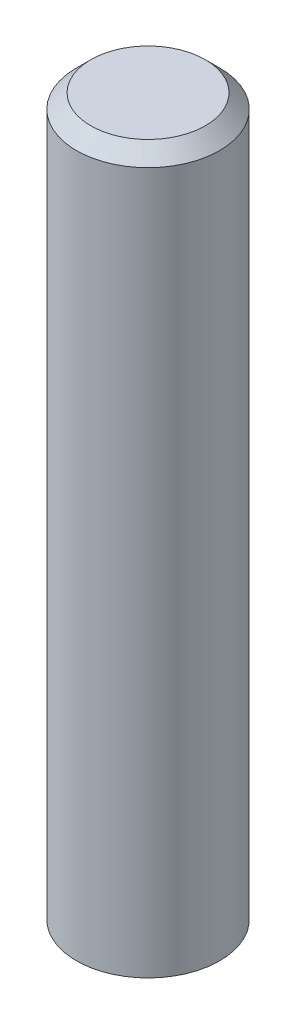
ISO-10303-21;
HEADER;
FILE_DESCRIPTION(('STEP AP214'),'2;1');
FILE_NAME('part.step','',(''),(''),'','','');
FILE_SCHEMA(('AUTOMOTIVE_DESIGN { 1 0 10303 214 1 1 1 1 }'));
ENDSEC;
DATA;
#1=APPLICATION_CONTEXT('core data for automotive mechanical design processes');
#2=APPLICATION_PROTOCOL_DEFINITION('international standard','automotive_design',2000,#1);
#3=PRODUCT_CONTEXT('',#1,'mechanical');
#4=PRODUCT('Part','Part','',(#3));
#5=PRODUCT_RELATED_PRODUCT_CATEGORY('part','',(#4));
#6=PRODUCT_DEFINITION_FORMATION('','',#4);
#7=PRODUCT_DEFINITION_CONTEXT('part definition',#1,'design');
#8=PRODUCT_DEFINITION('design','',#6,#7);
#9=PRODUCT_DEFINITION_SHAPE('','',#8);
#10=(LENGTH_UNIT() NAMED_UNIT(*) SI_UNIT(.MILLI.,.METRE.));
#11=(NAMED_UNIT(*) PLANE_ANGLE_UNIT() SI_UNIT($,.RADIAN.));
#12=(NAMED_UNIT(*) SI_UNIT($,.STERADIAN.) SOLID_ANGLE_UNIT());
#13=UNCERTAINTY_MEASURE_WITH_UNIT(LENGTH_MEASURE(1.E-05),#10,'distance_accuracy_value','');
#14=(GEOMETRIC_REPRESENTATION_CONTEXT(3) GLOBAL_UNCERTAINTY_ASSIGNED_CONTEXT((#13)) GLOBAL_UNIT_ASSIGNED_CONTEXT((#10,
#11,#12)) REPRESENTATION_CONTEXT('',''));
#15=CARTESIAN_POINT('',(0.,0.,0.));
#16=DIRECTION('',(0.,0.,1.));
#17=DIRECTION('',(1.,0.,0.));
#18=AXIS2_PLACEMENT_3D('',#15,#16,#17);
#19=CARTESIAN_POINT('',(0.,24.5,0.));
#20=DIRECTION('',(0.,1.,0.));
#21=DIRECTION('',(0.,0.,1.));
#22=AXIS2_PLACEMENT_3D('',#19,#20,#21);
#23=PLANE('',#22);
#24=CARTESIAN_POINT('',(0.,24.5,0.));
#25=DIRECTION('',(0.,-1.,0.));
#26=DIRECTION('',(0.,0.,-1.));
#27=AXIS2_PLACEMENT_3D('',#24,#25,#26);
#28=CIRCLE('',#27,2.);
#29=CARTESIAN_POINT('',(0.,24.5,-2.));
#30=VERTEX_POINT('',#29);
#31=EDGE_CURVE('E60',#30,#30,#28,.T.);
#32=ORIENTED_EDGE('',*,*,#31,.T.);
#33=EDGE_LOOP('',(#32));
#34=FACE_BOUND('',#33,.T.);
#35=ADVANCED_FACE('F37',(#34),#23,.F.);
#36=CARTESIAN_POINT('',(-2.,25.,0.));
#37=DIRECTION('',(0.,-1.,0.));
#38=DIRECTION('',(0.,0.,-1.));
#39=AXIS2_PLACEMENT_3D('',#36,#37,#38);
#40=PLANE('',#39);
#41=CARTESIAN_POINT('',(0.,25.,0.));
#42=DIRECTION('',(0.,-1.,0.));
#43=DIRECTION('',(0.,0.,-1.));
#44=AXIS2_PLACEMENT_3D('',#41,#42,#43);
#45=CIRCLE('',#44,2.);
#46=CARTESIAN_POINT('',(0.,25.,-2.));
#47=VERTEX_POINT('',#46);
#48=EDGE_CURVE('E10',#47,#47,#45,.T.);
#49=ORIENTED_EDGE('',*,*,#48,.F.);
#50=EDGE_LOOP('',(#49));
#51=FACE_BOUND('',#50,.T.);
#52=ADVANCED_FACE('F85',(#51),#40,.F.);
#53=CARTESIAN_POINT('',(0.,25.,0.));
#54=DIRECTION('',(0.,-1.,0.));
#55=DIRECTION('',(0.,0.,-1.));
#56=AXIS2_PLACEMENT_3D('',#53,#54,#55);
#57=CONICAL_SURFACE('',#56,2.,0.785398163397445);
#58=CARTESIAN_POINT('',(0.,24.5,0.));
#59=DIRECTION('',(0.,-1.,0.));
#60=DIRECTION('',(0.,0.,-1.));
#61=AXIS2_PLACEMENT_3D('',#58,#59,#60);
#62=CIRCLE('',#61,2.5);
#63=CARTESIAN_POINT('',(0.,24.5,-2.5));
#64=VERTEX_POINT('',#63);
#65=EDGE_CURVE('E44',#64,#64,#62,.T.);
#66=ORIENTED_EDGE('',*,*,#65,.F.);
#67=EDGE_LOOP('',(#66));
#68=FACE_BOUND('',#67,.T.);
#69=ORIENTED_EDGE('',*,*,#48,.T.);
#70=EDGE_LOOP('',(#69));
#71=FACE_BOUND('',#70,.T.);
#72=ADVANCED_FACE('F80',(#68,#71),#57,.T.);
#73=CARTESIAN_POINT('',(0.,0.,0.));
#74=DIRECTION('',(0.,-1.,0.));
#75=DIRECTION('',(0.,0.,-1.));
#76=AXIS2_PLACEMENT_3D('',#73,#74,#75);
#77=CYLINDRICAL_SURFACE('',#76,2.5);
#78=CARTESIAN_POINT('',(0.,0.,0.));
#79=DIRECTION('',(0.,-1.,0.));
#80=DIRECTION('',(0.,0.,-1.));
#81=AXIS2_PLACEMENT_3D('',#78,#79,#80);
#82=CIRCLE('',#81,2.5);
#83=CARTESIAN_POINT('',(0.,0.,-2.5));
#84=VERTEX_POINT('',#83);
#85=EDGE_CURVE('E49',#84,#84,#82,.T.);
#86=ORIENTED_EDGE('',*,*,#85,.F.);
#87=EDGE_LOOP('',(#86));
#88=FACE_BOUND('',#87,.T.);
#89=ORIENTED_EDGE('',*,*,#65,.T.);
#90=EDGE_LOOP('',(#89));
#91=FACE_BOUND('',#90,.T.);
#92=ADVANCED_FACE('F75',(#88,#91),#77,.T.);
#93=CARTESIAN_POINT('',(-2.,0.,0.));
#94=DIRECTION('',(0.,1.,0.));
#95=DIRECTION('',(0.,0.,1.));
#96=AXIS2_PLACEMENT_3D('',#93,#94,#95);
#97=PLANE('',#96);
#98=CARTESIAN_POINT('',(0.,0.,0.));
#99=DIRECTION('',(0.,-1.,0.));
#100=DIRECTION('',(0.,0.,-1.));
#101=AXIS2_PLACEMENT_3D('',#98,#99,#100);
#102=CIRCLE('',#101,2.);
#103=CARTESIAN_POINT('',(0.,0.,-2.));
#104=VERTEX_POINT('',#103);
#105=EDGE_CURVE('E54',#104,#104,#102,.T.);
#106=ORIENTED_EDGE('',*,*,#105,.F.);
#107=EDGE_LOOP('',(#106));
#108=FACE_BOUND('',#107,.T.);
#109=ORIENTED_EDGE('',*,*,#85,.T.);
#110=EDGE_LOOP('',(#109));
#111=FACE_BOUND('',#110,.T.);
#112=ADVANCED_FACE('F69',(#108,#111),#97,.F.);
#113=CARTESIAN_POINT('',(0.,0.,0.));
#114=DIRECTION('',(0.,-1.,0.));
#115=DIRECTION('',(0.,0.,-1.));
#116=AXIS2_PLACEMENT_3D('',#113,#114,#115);
#117=CYLINDRICAL_SURFACE('',#116,2.);
#118=ORIENTED_EDGE('',*,*,#31,.F.);
#119=EDGE_LOOP('',(#118));
#120=FACE_BOUND('',#119,.T.);
#121=ORIENTED_EDGE('',*,*,#105,.T.);
#122=EDGE_LOOP('',(#121));
#123=FACE_BOUND('',#122,.T.);
#124=ADVANCED_FACE('F66',(#120,#123),#117,.F.);
#125=CLOSED_SHELL('',(#35,#52,#72,#92,#112,#124));
#126=MANIFOLD_SOLID_BREP('B2',#125);
#127=ADVANCED_BREP_SHAPE_REPRESENTATION('',(#18,#126),#14);
#128=SHAPE_DEFINITION_REPRESENTATION(#9,#127);
ENDSEC;
END-ISO-10303-21;
